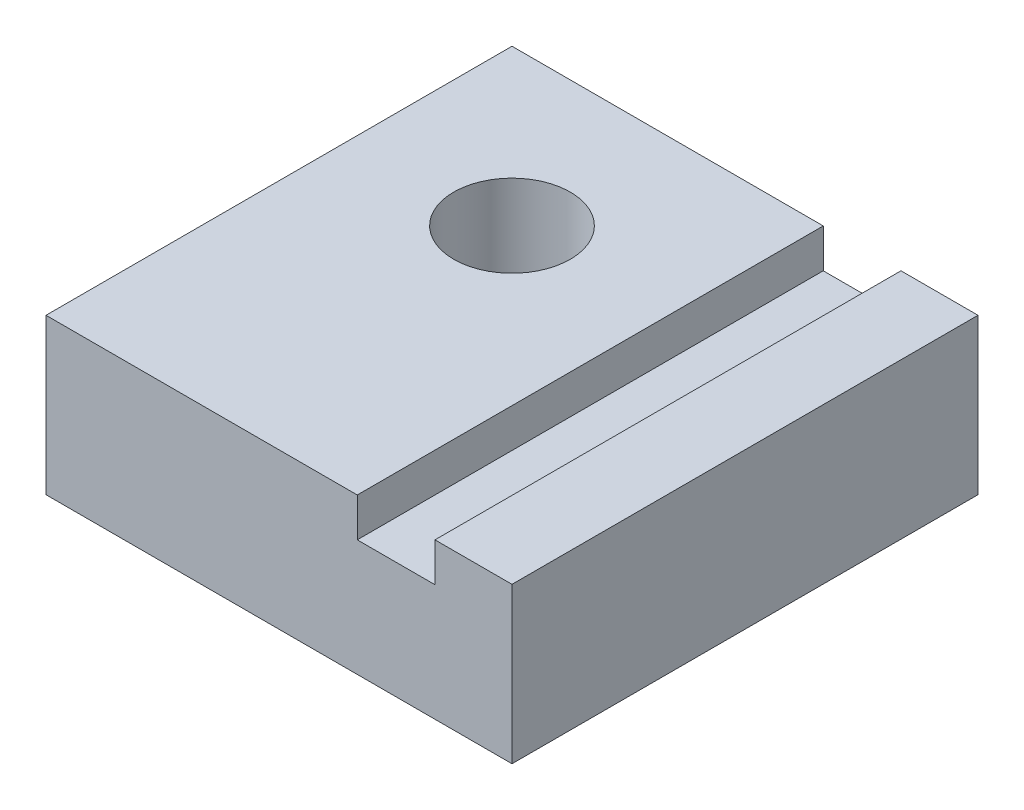
ISO-10303-21;
HEADER;
FILE_DESCRIPTION(('STEP AP214'),'2;1');
FILE_NAME('part.step','',(''),(''),'','','');
FILE_SCHEMA(('AUTOMOTIVE_DESIGN { 1 0 10303 214 1 1 1 1 }'));
ENDSEC;
DATA;
#1=APPLICATION_CONTEXT('core data for automotive mechanical design processes');
#2=APPLICATION_PROTOCOL_DEFINITION('international standard','automotive_design',2000,#1);
#3=PRODUCT_CONTEXT('',#1,'mechanical');
#4=PRODUCT('Part','Part','',(#3));
#5=PRODUCT_RELATED_PRODUCT_CATEGORY('part','',(#4));
#6=PRODUCT_DEFINITION_FORMATION('','',#4);
#7=PRODUCT_DEFINITION_CONTEXT('part definition',#1,'design');
#8=PRODUCT_DEFINITION('design','',#6,#7);
#9=PRODUCT_DEFINITION_SHAPE('','',#8);
#10=(LENGTH_UNIT() NAMED_UNIT(*) SI_UNIT(.MILLI.,.METRE.));
#11=(NAMED_UNIT(*) PLANE_ANGLE_UNIT() SI_UNIT($,.RADIAN.));
#12=(NAMED_UNIT(*) SI_UNIT($,.STERADIAN.) SOLID_ANGLE_UNIT());
#13=UNCERTAINTY_MEASURE_WITH_UNIT(LENGTH_MEASURE(1.E-05),#10,'distance_accuracy_value','');
#14=(GEOMETRIC_REPRESENTATION_CONTEXT(3) GLOBAL_UNCERTAINTY_ASSIGNED_CONTEXT((#13)) GLOBAL_UNIT_ASSIGNED_CONTEXT((#10,
#11,#12)) REPRESENTATION_CONTEXT('',''));
#15=CARTESIAN_POINT('',(0.,0.,0.));
#16=DIRECTION('',(0.,0.,1.));
#17=DIRECTION('',(1.,0.,0.));
#18=AXIS2_PLACEMENT_3D('',#15,#16,#17);
#19=CARTESIAN_POINT('',(0.,25.4,0.));
#20=DIRECTION('',(0.,-1.,0.));
#21=DIRECTION('',(0.,0.,-1.));
#22=AXIS2_PLACEMENT_3D('',#19,#20,#21);
#23=PLANE('',#22);
#24=CARTESIAN_POINT('',(-12.6779635113784,25.4,-12.6779635113784));
#25=DIRECTION('',(0.,1.,0.));
#26=DIRECTION('',(0.,0.,1.));
#27=AXIS2_PLACEMENT_3D('',#24,#25,#26);
#28=CIRCLE('',#27,9.525);
#29=CARTESIAN_POINT('',(-12.6779635113784,25.4,-3.15296351137838));
#30=VERTEX_POINT('',#29);
#31=EDGE_CURVE('E173',#30,#30,#28,.T.);
#32=ORIENTED_EDGE('',*,*,#31,.F.);
#33=EDGE_LOOP('',(#32));
#34=FACE_BOUND('',#33,.T.);
#35=DIRECTION('',(1.,0.,0.));
#36=VECTOR('',#35,1.);
#37=CARTESIAN_POINT('',(-38.0779635113784,25.4,38.0779635113784));
#38=LINE('',#37,#36);
#39=CARTESIAN_POINT('',(-38.0779635113784,25.4,38.0779635113784));
#40=VERTEX_POINT('',#39);
#41=CARTESIAN_POINT('',(12.7893760049178,25.4,38.0779635113784));
#42=VERTEX_POINT('',#41);
#43=EDGE_CURVE('E190',#40,#42,#38,.T.);
#44=ORIENTED_EDGE('',*,*,#43,.T.);
#45=DIRECTION('',(0.,0.,1.));
#46=VECTOR('',#45,1.);
#47=CARTESIAN_POINT('',(12.7893760049178,25.4,-38.0779635113784));
#48=LINE('',#47,#46);
#49=CARTESIAN_POINT('',(12.7893760049178,25.4,-38.0779635113784));
#50=VERTEX_POINT('',#49);
#51=EDGE_CURVE('E168',#50,#42,#48,.T.);
#52=ORIENTED_EDGE('',*,*,#51,.F.);
#53=DIRECTION('',(-1.,0.,0.));
#54=VECTOR('',#53,1.);
#55=CARTESIAN_POINT('',(-38.0779635113784,25.4,-38.0779635113784));
#56=LINE('',#55,#54);
#57=CARTESIAN_POINT('',(-38.0779635113784,25.4,-38.0779635113784));
#58=VERTEX_POINT('',#57);
#59=EDGE_CURVE('E184',#50,#58,#56,.T.);
#60=ORIENTED_EDGE('',*,*,#59,.T.);
#61=DIRECTION('',(0.,0.,1.));
#62=VECTOR('',#61,1.);
#63=CARTESIAN_POINT('',(-38.0779635113784,25.4,38.0779635113784));
#64=LINE('',#63,#62);
#65=EDGE_CURVE('E187',#58,#40,#64,.T.);
#66=ORIENTED_EDGE('',*,*,#65,.T.);
#67=EDGE_LOOP('',(#44,#52,#60,#66));
#68=FACE_BOUND('',#67,.T.);
#69=ADVANCED_FACE('F55',(#34,#68),#23,.F.);
#70=CARTESIAN_POINT('',(38.0779635113784,25.4,-38.0779635113784));
#71=VERTEX_POINT('',#70);
#72=CARTESIAN_POINT('',(25.4893760049178,25.4,-38.0779635113784));
#73=VERTEX_POINT('',#72);
#74=EDGE_CURVE('E109',#71,#73,#56,.T.);
#75=ORIENTED_EDGE('',*,*,#74,.T.);
#76=DIRECTION('',(0.,0.,1.));
#77=VECTOR('',#76,1.);
#78=CARTESIAN_POINT('',(25.4893760049178,25.4,-38.0779635113784));
#79=LINE('',#78,#77);
#80=CARTESIAN_POINT('',(25.4893760049178,25.4,38.0779635113784));
#81=VERTEX_POINT('',#80);
#82=EDGE_CURVE('E139',#73,#81,#79,.T.);
#83=ORIENTED_EDGE('',*,*,#82,.T.);
#84=CARTESIAN_POINT('',(38.0779635113784,25.4,38.0779635113784));
#85=VERTEX_POINT('',#84);
#86=EDGE_CURVE('E80',#81,#85,#38,.T.);
#87=ORIENTED_EDGE('',*,*,#86,.T.);
#88=DIRECTION('',(0.,0.,-1.));
#89=VECTOR('',#88,1.);
#90=CARTESIAN_POINT('',(38.0779635113784,25.4,38.0779635113784));
#91=LINE('',#90,#89);
#92=EDGE_CURVE('E181',#85,#71,#91,.T.);
#93=ORIENTED_EDGE('',*,*,#92,.T.);
#94=EDGE_LOOP('',(#75,#83,#87,#93));
#95=FACE_BOUND('',#94,.T.);
#96=ADVANCED_FACE('F288',(#95),#23,.F.);
#97=CARTESIAN_POINT('',(0.,0.,0.));
#98=DIRECTION('',(0.,-1.,0.));
#99=DIRECTION('',(0.,0.,-1.));
#100=AXIS2_PLACEMENT_3D('',#97,#98,#99);
#101=PLANE('',#100);
#102=DIRECTION('',(0.,0.,-1.));
#103=VECTOR('',#102,1.);
#104=CARTESIAN_POINT('',(38.0779635113784,0.,38.0779635113784));
#105=LINE('',#104,#103);
#106=CARTESIAN_POINT('',(38.0779635113784,0.,38.0779635113784));
#107=VERTEX_POINT('',#106);
#108=CARTESIAN_POINT('',(38.0779635113784,0.,-38.0779635113784));
#109=VERTEX_POINT('',#108);
#110=EDGE_CURVE('E177',#107,#109,#105,.T.);
#111=ORIENTED_EDGE('',*,*,#110,.F.);
#112=DIRECTION('',(1.,0.,0.));
#113=VECTOR('',#112,1.);
#114=CARTESIAN_POINT('',(-38.0779635113784,0.,38.0779635113784));
#115=LINE('',#114,#113);
#116=CARTESIAN_POINT('',(-38.0779635113784,0.,38.0779635113784));
#117=VERTEX_POINT('',#116);
#118=EDGE_CURVE('E102',#117,#107,#115,.T.);
#119=ORIENTED_EDGE('',*,*,#118,.F.);
#120=DIRECTION('',(0.,0.,1.));
#121=VECTOR('',#120,1.);
#122=CARTESIAN_POINT('',(-38.0779635113784,0.,38.0779635113784));
#123=LINE('',#122,#121);
#124=CARTESIAN_POINT('',(-38.0779635113784,0.,-38.0779635113784));
#125=VERTEX_POINT('',#124);
#126=EDGE_CURVE('E201',#125,#117,#123,.T.);
#127=ORIENTED_EDGE('',*,*,#126,.F.);
#128=DIRECTION('',(-1.,0.,0.));
#129=VECTOR('',#128,1.);
#130=CARTESIAN_POINT('',(-38.0779635113784,0.,-38.0779635113784));
#131=LINE('',#130,#129);
#132=EDGE_CURVE('E198',#109,#125,#131,.T.);
#133=ORIENTED_EDGE('',*,*,#132,.F.);
#134=EDGE_LOOP('',(#111,#119,#127,#133));
#135=FACE_BOUND('',#134,.T.);
#136=CARTESIAN_POINT('',(-12.6779635113784,0.,-12.6779635113784));
#137=DIRECTION('',(0.,1.,0.));
#138=DIRECTION('',(0.,0.,1.));
#139=AXIS2_PLACEMENT_3D('',#136,#137,#138);
#140=CIRCLE('',#139,9.525);
#141=CARTESIAN_POINT('',(-12.6779635113784,0.,-3.15296351137838));
#142=VERTEX_POINT('',#141);
#143=EDGE_CURVE('E167',#142,#142,#140,.T.);
#144=ORIENTED_EDGE('',*,*,#143,.T.);
#145=EDGE_LOOP('',(#144));
#146=FACE_BOUND('',#145,.T.);
#147=ADVANCED_FACE('F222',(#135,#146),#101,.T.);
#148=CARTESIAN_POINT('',(38.0779635113784,25.4,38.0779635113784));
#149=DIRECTION('',(-1.,0.,0.));
#150=DIRECTION('',(0.,0.,1.));
#151=AXIS2_PLACEMENT_3D('',#148,#149,#150);
#152=PLANE('',#151);
#153=ORIENTED_EDGE('',*,*,#110,.T.);
#154=DIRECTION('',(0.,-1.,0.));
#155=VECTOR('',#154,1.);
#156=CARTESIAN_POINT('',(38.0779635113784,25.4,-38.0779635113784));
#157=LINE('',#156,#155);
#158=EDGE_CURVE('E13',#71,#109,#157,.T.);
#159=ORIENTED_EDGE('',*,*,#158,.F.);
#160=ORIENTED_EDGE('',*,*,#92,.F.);
#161=DIRECTION('',(0.,-1.,0.));
#162=VECTOR('',#161,1.);
#163=CARTESIAN_POINT('',(38.0779635113784,25.4,38.0779635113784));
#164=LINE('',#163,#162);
#165=EDGE_CURVE('E194',#85,#107,#164,.T.);
#166=ORIENTED_EDGE('',*,*,#165,.T.);
#167=EDGE_LOOP('',(#153,#159,#160,#166));
#168=FACE_BOUND('',#167,.T.);
#169=ADVANCED_FACE('F57',(#168),#152,.F.);
#170=CARTESIAN_POINT('',(-38.0779635113784,25.4,-38.0779635113784));
#171=DIRECTION('',(0.,0.,1.));
#172=DIRECTION('',(1.,0.,0.));
#173=AXIS2_PLACEMENT_3D('',#170,#171,#172);
#174=PLANE('',#173);
#175=ORIENTED_EDGE('',*,*,#59,.F.);
#176=DIRECTION('',(0.,-1.,0.));
#177=VECTOR('',#176,1.);
#178=CARTESIAN_POINT('',(12.7893760049178,25.4,-38.0779635113784));
#179=LINE('',#178,#177);
#180=CARTESIAN_POINT('',(12.7893760049178,19.05,-38.0779635113784));
#181=VERTEX_POINT('',#180);
#182=EDGE_CURVE('E140',#50,#181,#179,.T.);
#183=ORIENTED_EDGE('',*,*,#182,.T.);
#184=DIRECTION('',(1.,0.,0.));
#185=VECTOR('',#184,1.);
#186=CARTESIAN_POINT('',(25.4893760049178,19.05,-38.0779635113784));
#187=LINE('',#186,#185);
#188=CARTESIAN_POINT('',(25.4893760049178,19.05,-38.0779635113784));
#189=VERTEX_POINT('',#188);
#190=EDGE_CURVE('E134',#181,#189,#187,.T.);
#191=ORIENTED_EDGE('',*,*,#190,.T.);
#192=DIRECTION('',(0.,1.,0.));
#193=VECTOR('',#192,1.);
#194=CARTESIAN_POINT('',(25.4893760049178,25.4,-38.0779635113784));
#195=LINE('',#194,#193);
#196=EDGE_CURVE('E142',#189,#73,#195,.T.);
#197=ORIENTED_EDGE('',*,*,#196,.T.);
#198=ORIENTED_EDGE('',*,*,#74,.F.);
#199=ORIENTED_EDGE('',*,*,#158,.T.);
#200=ORIENTED_EDGE('',*,*,#132,.T.);
#201=DIRECTION('',(0.,-1.,0.));
#202=VECTOR('',#201,1.);
#203=CARTESIAN_POINT('',(-38.0779635113784,25.4,-38.0779635113784));
#204=LINE('',#203,#202);
#205=EDGE_CURVE('E64',#58,#125,#204,.T.);
#206=ORIENTED_EDGE('',*,*,#205,.F.);
#207=EDGE_LOOP('',(#175,#183,#191,#197,#198,#199,#200,#206));
#208=FACE_BOUND('',#207,.T.);
#209=ADVANCED_FACE('F147',(#208),#174,.F.);
#210=CARTESIAN_POINT('',(-38.0779635113784,25.4,38.0779635113784));
#211=DIRECTION('',(1.,0.,0.));
#212=DIRECTION('',(0.,0.,-1.));
#213=AXIS2_PLACEMENT_3D('',#210,#211,#212);
#214=PLANE('',#213);
#215=ORIENTED_EDGE('',*,*,#126,.T.);
#216=DIRECTION('',(0.,-1.,0.));
#217=VECTOR('',#216,1.);
#218=CARTESIAN_POINT('',(-38.0779635113784,25.4,38.0779635113784));
#219=LINE('',#218,#217);
#220=EDGE_CURVE('E208',#40,#117,#219,.T.);
#221=ORIENTED_EDGE('',*,*,#220,.F.);
#222=ORIENTED_EDGE('',*,*,#65,.F.);
#223=ORIENTED_EDGE('',*,*,#205,.T.);
#224=EDGE_LOOP('',(#215,#221,#222,#223));
#225=FACE_BOUND('',#224,.T.);
#226=ADVANCED_FACE('F218',(#225),#214,.F.);
#227=CARTESIAN_POINT('',(-38.0779635113784,25.4,38.0779635113784));
#228=DIRECTION('',(0.,0.,-1.));
#229=DIRECTION('',(-1.,0.,0.));
#230=AXIS2_PLACEMENT_3D('',#227,#228,#229);
#231=PLANE('',#230);
#232=DIRECTION('',(1.,0.,0.));
#233=VECTOR('',#232,1.);
#234=CARTESIAN_POINT('',(25.4893760049178,19.05,38.0779635113784));
#235=LINE('',#234,#233);
#236=CARTESIAN_POINT('',(12.7893760049178,19.05,38.0779635113784));
#237=VERTEX_POINT('',#236);
#238=CARTESIAN_POINT('',(25.4893760049178,19.05,38.0779635113784));
#239=VERTEX_POINT('',#238);
#240=EDGE_CURVE('E71',#237,#239,#235,.T.);
#241=ORIENTED_EDGE('',*,*,#240,.F.);
#242=DIRECTION('',(0.,-1.,0.));
#243=VECTOR('',#242,1.);
#244=CARTESIAN_POINT('',(12.7893760049178,25.4,38.0779635113784));
#245=LINE('',#244,#243);
#246=EDGE_CURVE('E149',#42,#237,#245,.T.);
#247=ORIENTED_EDGE('',*,*,#246,.F.);
#248=ORIENTED_EDGE('',*,*,#43,.F.);
#249=ORIENTED_EDGE('',*,*,#220,.T.);
#250=ORIENTED_EDGE('',*,*,#118,.T.);
#251=ORIENTED_EDGE('',*,*,#165,.F.);
#252=ORIENTED_EDGE('',*,*,#86,.F.);
#253=DIRECTION('',(0.,1.,0.));
#254=VECTOR('',#253,1.);
#255=CARTESIAN_POINT('',(25.4893760049178,25.4,38.0779635113784));
#256=LINE('',#255,#254);
#257=EDGE_CURVE('E155',#239,#81,#256,.T.);
#258=ORIENTED_EDGE('',*,*,#257,.F.);
#259=EDGE_LOOP('',(#241,#247,#248,#249,#250,#251,#252,#258));
#260=FACE_BOUND('',#259,.T.);
#261=ADVANCED_FACE('F227',(#260),#231,.F.);
#262=CARTESIAN_POINT('',(-12.6779635113784,25.4,-12.6779635113784));
#263=DIRECTION('',(0.,-1.,0.));
#264=DIRECTION('',(0.,0.,-1.));
#265=AXIS2_PLACEMENT_3D('',#262,#263,#264);
#266=CYLINDRICAL_SURFACE('',#265,9.525);
#267=ORIENTED_EDGE('',*,*,#31,.T.);
#268=EDGE_LOOP('',(#267));
#269=FACE_BOUND('',#268,.T.);
#270=ORIENTED_EDGE('',*,*,#143,.F.);
#271=EDGE_LOOP('',(#270));
#272=FACE_BOUND('',#271,.T.);
#273=ADVANCED_FACE('F285',(#269,#272),#266,.F.);
#274=CARTESIAN_POINT('',(25.4893760049178,19.05,-38.0779635113784));
#275=DIRECTION('',(0.,-1.,0.));
#276=DIRECTION('',(0.,0.,-1.));
#277=AXIS2_PLACEMENT_3D('',#274,#275,#276);
#278=PLANE('',#277);
#279=ORIENTED_EDGE('',*,*,#240,.T.);
#280=DIRECTION('',(0.,0.,1.));
#281=VECTOR('',#280,1.);
#282=CARTESIAN_POINT('',(25.4893760049178,19.05,-38.0779635113784));
#283=LINE('',#282,#281);
#284=EDGE_CURVE('E130',#189,#239,#283,.T.);
#285=ORIENTED_EDGE('',*,*,#284,.F.);
#286=ORIENTED_EDGE('',*,*,#190,.F.);
#287=DIRECTION('',(0.,0.,1.));
#288=VECTOR('',#287,1.);
#289=CARTESIAN_POINT('',(12.7893760049178,19.05,-38.0779635113784));
#290=LINE('',#289,#288);
#291=EDGE_CURVE('E164',#181,#237,#290,.T.);
#292=ORIENTED_EDGE('',*,*,#291,.T.);
#293=EDGE_LOOP('',(#279,#285,#286,#292));
#294=FACE_BOUND('',#293,.T.);
#295=ADVANCED_FACE('F132',(#294),#278,.F.);
#296=CARTESIAN_POINT('',(12.7893760049178,25.4,-38.0779635113784));
#297=DIRECTION('',(-1.,0.,0.));
#298=DIRECTION('',(0.,0.,1.));
#299=AXIS2_PLACEMENT_3D('',#296,#297,#298);
#300=PLANE('',#299);
#301=ORIENTED_EDGE('',*,*,#246,.T.);
#302=ORIENTED_EDGE('',*,*,#291,.F.);
#303=ORIENTED_EDGE('',*,*,#182,.F.);
#304=ORIENTED_EDGE('',*,*,#51,.T.);
#305=EDGE_LOOP('',(#301,#302,#303,#304));
#306=FACE_BOUND('',#305,.T.);
#307=ADVANCED_FACE('F277',(#306),#300,.F.);
#308=CARTESIAN_POINT('',(25.4893760049178,25.4,-38.0779635113784));
#309=DIRECTION('',(1.,0.,0.));
#310=DIRECTION('',(0.,0.,-1.));
#311=AXIS2_PLACEMENT_3D('',#308,#309,#310);
#312=PLANE('',#311);
#313=ORIENTED_EDGE('',*,*,#257,.T.);
#314=ORIENTED_EDGE('',*,*,#82,.F.);
#315=ORIENTED_EDGE('',*,*,#196,.F.);
#316=ORIENTED_EDGE('',*,*,#284,.T.);
#317=EDGE_LOOP('',(#313,#314,#315,#316));
#318=FACE_BOUND('',#317,.T.);
#319=ADVANCED_FACE('F143',(#318),#312,.F.);
#320=CLOSED_SHELL('',(#69,#96,#147,#169,#209,#226,#261,#273,#295,#307,#319));
#321=MANIFOLD_SOLID_BREP('B2',#320);
#322=ADVANCED_BREP_SHAPE_REPRESENTATION('',(#18,#321),#14);
#323=SHAPE_DEFINITION_REPRESENTATION(#9,#322);
ENDSEC;
END-ISO-10303-21;
